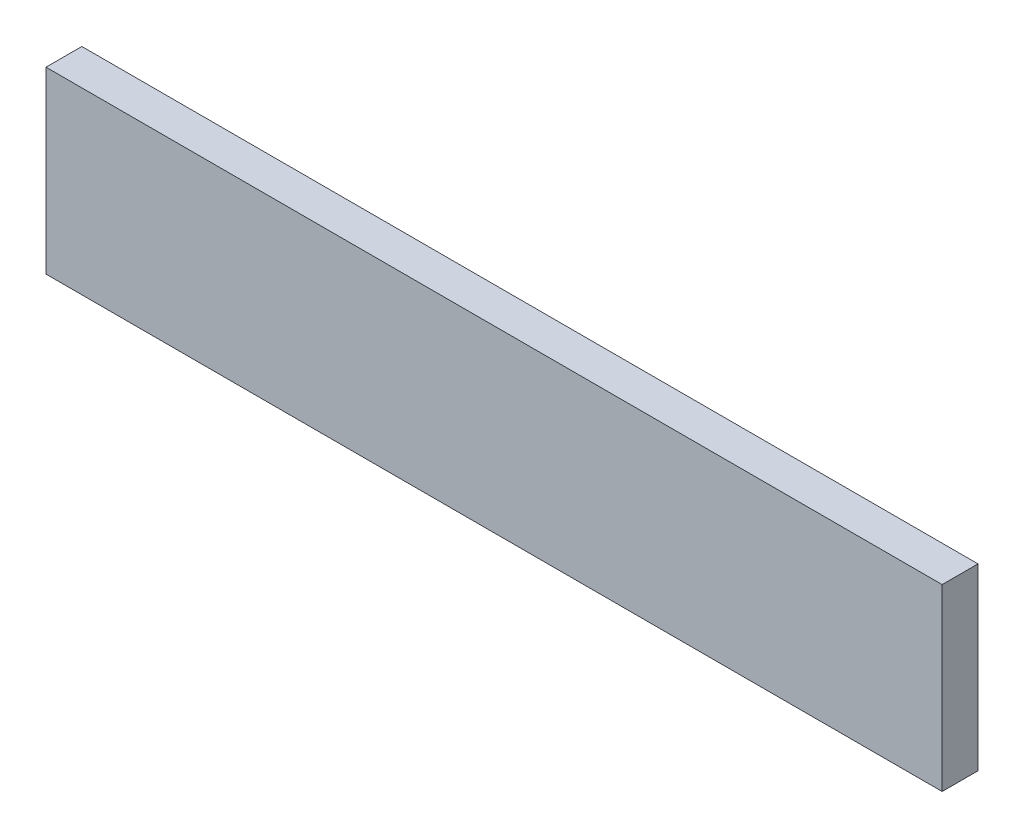
ISO-10303-21;
HEADER;
FILE_DESCRIPTION(('STEP AP214'),'2;1');
FILE_NAME('part.step','',(''),(''),'','','');
FILE_SCHEMA(('AUTOMOTIVE_DESIGN { 1 0 10303 214 1 1 1 1 }'));
ENDSEC;
DATA;
#1=APPLICATION_CONTEXT('core data for automotive mechanical design processes');
#2=APPLICATION_PROTOCOL_DEFINITION('international standard','automotive_design',2000,#1);
#3=PRODUCT_CONTEXT('',#1,'mechanical');
#4=PRODUCT('Part','Part','',(#3));
#5=PRODUCT_RELATED_PRODUCT_CATEGORY('part','',(#4));
#6=PRODUCT_DEFINITION_FORMATION('','',#4);
#7=PRODUCT_DEFINITION_CONTEXT('part definition',#1,'design');
#8=PRODUCT_DEFINITION('design','',#6,#7);
#9=PRODUCT_DEFINITION_SHAPE('','',#8);
#10=(LENGTH_UNIT() NAMED_UNIT(*) SI_UNIT(.MILLI.,.METRE.));
#11=(NAMED_UNIT(*) PLANE_ANGLE_UNIT() SI_UNIT($,.RADIAN.));
#12=(NAMED_UNIT(*) SI_UNIT($,.STERADIAN.) SOLID_ANGLE_UNIT());
#13=UNCERTAINTY_MEASURE_WITH_UNIT(LENGTH_MEASURE(1.E-05),#10,'distance_accuracy_value','');
#14=(GEOMETRIC_REPRESENTATION_CONTEXT(3) GLOBAL_UNCERTAINTY_ASSIGNED_CONTEXT((#13)) GLOBAL_UNIT_ASSIGNED_CONTEXT((#10,
#11,#12)) REPRESENTATION_CONTEXT('',''));
#15=CARTESIAN_POINT('',(0.,0.,0.));
#16=DIRECTION('',(0.,0.,1.));
#17=DIRECTION('',(1.,0.,0.));
#18=AXIS2_PLACEMENT_3D('',#15,#16,#17);
#19=CARTESIAN_POINT('',(25.,-5.,2.));
#20=DIRECTION('',(-1.,0.,0.));
#21=DIRECTION('',(0.,0.,1.));
#22=AXIS2_PLACEMENT_3D('',#19,#20,#21);
#23=PLANE('',#22);
#24=DIRECTION('',(0.,1.,0.));
#25=VECTOR('',#24,1.);
#26=CARTESIAN_POINT('',(25.,-5.,0.));
#27=LINE('',#26,#25);
#28=CARTESIAN_POINT('',(25.,-5.,0.));
#29=VERTEX_POINT('',#28);
#30=CARTESIAN_POINT('',(25.,5.,0.));
#31=VERTEX_POINT('',#30);
#32=EDGE_CURVE('E96',#29,#31,#27,.T.);
#33=ORIENTED_EDGE('',*,*,#32,.T.);
#34=DIRECTION('',(0.,0.,-1.));
#35=VECTOR('',#34,1.);
#36=CARTESIAN_POINT('',(25.,5.,2.));
#37=LINE('',#36,#35);
#38=CARTESIAN_POINT('',(25.,5.,2.));
#39=VERTEX_POINT('',#38);
#40=EDGE_CURVE('E11',#39,#31,#37,.T.);
#41=ORIENTED_EDGE('',*,*,#40,.F.);
#42=DIRECTION('',(0.,1.,0.));
#43=VECTOR('',#42,1.);
#44=CARTESIAN_POINT('',(25.,-5.,2.));
#45=LINE('',#44,#43);
#46=CARTESIAN_POINT('',(25.,-5.,2.));
#47=VERTEX_POINT('',#46);
#48=EDGE_CURVE('E84',#47,#39,#45,.T.);
#49=ORIENTED_EDGE('',*,*,#48,.F.);
#50=DIRECTION('',(0.,0.,-1.));
#51=VECTOR('',#50,1.);
#52=CARTESIAN_POINT('',(25.,-5.,2.));
#53=LINE('',#52,#51);
#54=EDGE_CURVE('E92',#47,#29,#53,.T.);
#55=ORIENTED_EDGE('',*,*,#54,.T.);
#56=EDGE_LOOP('',(#33,#41,#49,#55));
#57=FACE_BOUND('',#56,.T.);
#58=ADVANCED_FACE('F33',(#57),#23,.F.);
#59=CARTESIAN_POINT('',(-25.,5.,2.));
#60=DIRECTION('',(0.,-1.,0.));
#61=DIRECTION('',(0.,0.,-1.));
#62=AXIS2_PLACEMENT_3D('',#59,#60,#61);
#63=PLANE('',#62);
#64=DIRECTION('',(-1.,0.,0.));
#65=VECTOR('',#64,1.);
#66=CARTESIAN_POINT('',(-25.,5.,0.));
#67=LINE('',#66,#65);
#68=CARTESIAN_POINT('',(-25.,5.,0.));
#69=VERTEX_POINT('',#68);
#70=EDGE_CURVE('E88',#31,#69,#67,.T.);
#71=ORIENTED_EDGE('',*,*,#70,.T.);
#72=DIRECTION('',(0.,0.,-1.));
#73=VECTOR('',#72,1.);
#74=CARTESIAN_POINT('',(-25.,5.,2.));
#75=LINE('',#74,#73);
#76=CARTESIAN_POINT('',(-25.,5.,2.));
#77=VERTEX_POINT('',#76);
#78=EDGE_CURVE('E41',#77,#69,#75,.T.);
#79=ORIENTED_EDGE('',*,*,#78,.F.);
#80=DIRECTION('',(-1.,0.,0.));
#81=VECTOR('',#80,1.);
#82=CARTESIAN_POINT('',(-25.,5.,2.));
#83=LINE('',#82,#81);
#84=EDGE_CURVE('E79',#39,#77,#83,.T.);
#85=ORIENTED_EDGE('',*,*,#84,.F.);
#86=ORIENTED_EDGE('',*,*,#40,.T.);
#87=EDGE_LOOP('',(#71,#79,#85,#86));
#88=FACE_BOUND('',#87,.T.);
#89=ADVANCED_FACE('F87',(#88),#63,.F.);
#90=CARTESIAN_POINT('',(-25.,-5.,2.));
#91=DIRECTION('',(1.,0.,0.));
#92=DIRECTION('',(0.,0.,-1.));
#93=AXIS2_PLACEMENT_3D('',#90,#91,#92);
#94=PLANE('',#93);
#95=DIRECTION('',(0.,-1.,0.));
#96=VECTOR('',#95,1.);
#97=CARTESIAN_POINT('',(-25.,-5.,0.));
#98=LINE('',#97,#96);
#99=CARTESIAN_POINT('',(-25.,-5.,0.));
#100=VERTEX_POINT('',#99);
#101=EDGE_CURVE('E66',#69,#100,#98,.T.);
#102=ORIENTED_EDGE('',*,*,#101,.T.);
#103=DIRECTION('',(0.,0.,-1.));
#104=VECTOR('',#103,1.);
#105=CARTESIAN_POINT('',(-25.,-5.,2.));
#106=LINE('',#105,#104);
#107=CARTESIAN_POINT('',(-25.,-5.,2.));
#108=VERTEX_POINT('',#107);
#109=EDGE_CURVE('E89',#108,#100,#106,.T.);
#110=ORIENTED_EDGE('',*,*,#109,.F.);
#111=DIRECTION('',(0.,-1.,0.));
#112=VECTOR('',#111,1.);
#113=CARTESIAN_POINT('',(-25.,-5.,2.));
#114=LINE('',#113,#112);
#115=EDGE_CURVE('E82',#77,#108,#114,.T.);
#116=ORIENTED_EDGE('',*,*,#115,.F.);
#117=ORIENTED_EDGE('',*,*,#78,.T.);
#118=EDGE_LOOP('',(#102,#110,#116,#117));
#119=FACE_BOUND('',#118,.T.);
#120=ADVANCED_FACE('F90',(#119),#94,.F.);
#121=CARTESIAN_POINT('',(-25.,-5.,2.));
#122=DIRECTION('',(0.,1.,0.));
#123=DIRECTION('',(0.,0.,1.));
#124=AXIS2_PLACEMENT_3D('',#121,#122,#123);
#125=PLANE('',#124);
#126=DIRECTION('',(1.,0.,0.));
#127=VECTOR('',#126,1.);
#128=CARTESIAN_POINT('',(-25.,-5.,0.));
#129=LINE('',#128,#127);
#130=EDGE_CURVE('E72',#100,#29,#129,.T.);
#131=ORIENTED_EDGE('',*,*,#130,.T.);
#132=ORIENTED_EDGE('',*,*,#54,.F.);
#133=DIRECTION('',(1.,0.,0.));
#134=VECTOR('',#133,1.);
#135=CARTESIAN_POINT('',(-25.,-5.,2.));
#136=LINE('',#135,#134);
#137=EDGE_CURVE('E49',#108,#47,#136,.T.);
#138=ORIENTED_EDGE('',*,*,#137,.F.);
#139=ORIENTED_EDGE('',*,*,#109,.T.);
#140=EDGE_LOOP('',(#131,#132,#138,#139));
#141=FACE_BOUND('',#140,.T.);
#142=ADVANCED_FACE('F103',(#141),#125,.F.);
#143=CARTESIAN_POINT('',(0.,0.,2.));
#144=DIRECTION('',(0.,0.,-1.));
#145=DIRECTION('',(-1.,0.,0.));
#146=AXIS2_PLACEMENT_3D('',#143,#144,#145);
#147=PLANE('',#146);
#148=ORIENTED_EDGE('',*,*,#48,.T.);
#149=ORIENTED_EDGE('',*,*,#84,.T.);
#150=ORIENTED_EDGE('',*,*,#115,.T.);
#151=ORIENTED_EDGE('',*,*,#137,.T.);
#152=EDGE_LOOP('',(#148,#149,#150,#151));
#153=FACE_BOUND('',#152,.T.);
#154=ADVANCED_FACE('F80',(#153),#147,.F.);
#155=CARTESIAN_POINT('',(0.,0.,0.));
#156=DIRECTION('',(0.,0.,-1.));
#157=DIRECTION('',(-1.,0.,0.));
#158=AXIS2_PLACEMENT_3D('',#155,#156,#157);
#159=PLANE('',#158);
#160=ORIENTED_EDGE('',*,*,#32,.F.);
#161=ORIENTED_EDGE('',*,*,#130,.F.);
#162=ORIENTED_EDGE('',*,*,#101,.F.);
#163=ORIENTED_EDGE('',*,*,#70,.F.);
#164=EDGE_LOOP('',(#160,#161,#162,#163));
#165=FACE_BOUND('',#164,.T.);
#166=ADVANCED_FACE('F106',(#165),#159,.T.);
#167=CLOSED_SHELL('',(#58,#89,#120,#142,#154,#166));
#168=MANIFOLD_SOLID_BREP('B2',#167);
#169=ADVANCED_BREP_SHAPE_REPRESENTATION('',(#18,#168),#14);
#170=SHAPE_DEFINITION_REPRESENTATION(#9,#169);
ENDSEC;
END-ISO-10303-21;
